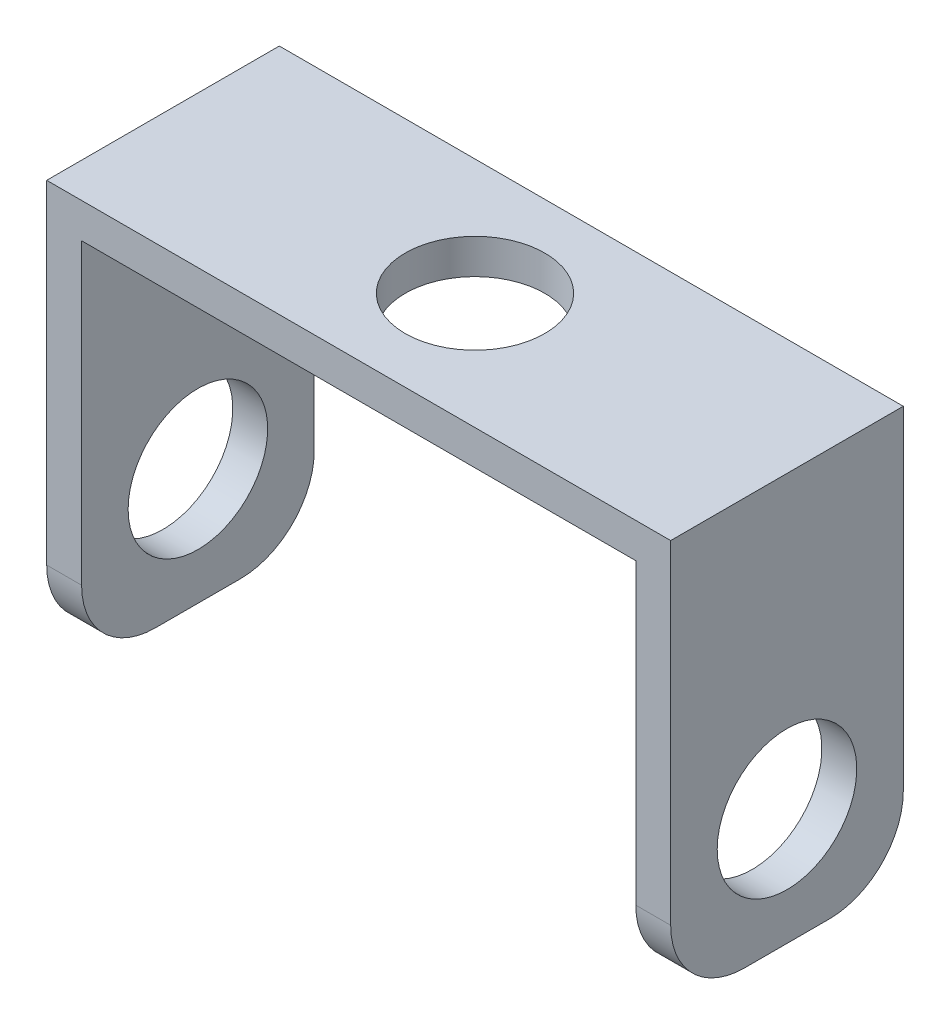
ISO-10303-21;
HEADER;
FILE_DESCRIPTION(('STEP AP214'),'2;1');
FILE_NAME('part.step','',(''),(''),'','','');
FILE_SCHEMA(('AUTOMOTIVE_DESIGN { 1 0 10303 214 1 1 1 1 }'));
ENDSEC;
DATA;
#1=APPLICATION_CONTEXT('core data for automotive mechanical design processes');
#2=APPLICATION_PROTOCOL_DEFINITION('international standard','automotive_design',2000,#1);
#3=PRODUCT_CONTEXT('',#1,'mechanical');
#4=PRODUCT('Part','Part','',(#3));
#5=PRODUCT_RELATED_PRODUCT_CATEGORY('part','',(#4));
#6=PRODUCT_DEFINITION_FORMATION('','',#4);
#7=PRODUCT_DEFINITION_CONTEXT('part definition',#1,'design');
#8=PRODUCT_DEFINITION('design','',#6,#7);
#9=PRODUCT_DEFINITION_SHAPE('','',#8);
#10=(LENGTH_UNIT() NAMED_UNIT(*) SI_UNIT(.MILLI.,.METRE.));
#11=(NAMED_UNIT(*) PLANE_ANGLE_UNIT() SI_UNIT($,.RADIAN.));
#12=(NAMED_UNIT(*) SI_UNIT($,.STERADIAN.) SOLID_ANGLE_UNIT());
#13=UNCERTAINTY_MEASURE_WITH_UNIT(LENGTH_MEASURE(1.E-05),#10,'distance_accuracy_value','');
#14=(GEOMETRIC_REPRESENTATION_CONTEXT(3) GLOBAL_UNCERTAINTY_ASSIGNED_CONTEXT((#13)) GLOBAL_UNIT_ASSIGNED_CONTEXT((#10,
#11,#12)) REPRESENTATION_CONTEXT('',''));
#15=CARTESIAN_POINT('',(0.,0.,0.));
#16=DIRECTION('',(0.,0.,1.));
#17=DIRECTION('',(1.,0.,0.));
#18=AXIS2_PLACEMENT_3D('',#15,#16,#17);
#19=CARTESIAN_POINT('',(0.,3.,0.));
#20=DIRECTION('',(0.,1.,0.));
#21=DIRECTION('',(0.,0.,1.));
#22=AXIS2_PLACEMENT_3D('',#19,#20,#21);
#23=PLANE('',#22);
#24=DIRECTION('',(-1.,0.,0.));
#25=VECTOR('',#24,1.);
#26=CARTESIAN_POINT('',(0.,3.,0.));
#27=LINE('',#26,#25);
#28=CARTESIAN_POINT('',(50.65,3.,0.));
#29=VERTEX_POINT('',#28);
#30=CARTESIAN_POINT('',(-3.,3.,0.));
#31=VERTEX_POINT('',#30);
#32=EDGE_CURVE('E156',#29,#31,#27,.T.);
#33=ORIENTED_EDGE('',*,*,#32,.T.);
#34=DIRECTION('',(0.,0.,-1.));
#35=VECTOR('',#34,1.);
#36=CARTESIAN_POINT('',(-3.,3.,0.));
#37=LINE('',#36,#35);
#38=CARTESIAN_POINT('',(-3.,3.,20.));
#39=VERTEX_POINT('',#38);
#40=EDGE_CURVE('E137',#39,#31,#37,.T.);
#41=ORIENTED_EDGE('',*,*,#40,.F.);
#42=DIRECTION('',(1.,0.,0.));
#43=VECTOR('',#42,1.);
#44=CARTESIAN_POINT('',(0.,3.,20.));
#45=LINE('',#44,#43);
#46=CARTESIAN_POINT('',(50.65,3.,20.));
#47=VERTEX_POINT('',#46);
#48=EDGE_CURVE('E149',#39,#47,#45,.T.);
#49=ORIENTED_EDGE('',*,*,#48,.T.);
#50=DIRECTION('',(0.,0.,1.));
#51=VECTOR('',#50,1.);
#52=CARTESIAN_POINT('',(50.65,3.,20.));
#53=LINE('',#52,#51);
#54=EDGE_CURVE('E192',#29,#47,#53,.T.);
#55=ORIENTED_EDGE('',*,*,#54,.F.);
#56=EDGE_LOOP('',(#33,#41,#49,#55));
#57=FACE_BOUND('',#56,.T.);
#58=CARTESIAN_POINT('',(23.825,3.,10.));
#59=DIRECTION('',(0.,1.,0.));
#60=DIRECTION('',(0.,0.,1.));
#61=AXIS2_PLACEMENT_3D('',#58,#59,#60);
#62=CIRCLE('',#61,6.);
#63=CARTESIAN_POINT('',(23.825,3.,16.));
#64=VERTEX_POINT('',#63);
#65=EDGE_CURVE('E200',#64,#64,#62,.T.);
#66=ORIENTED_EDGE('',*,*,#65,.F.);
#67=EDGE_LOOP('',(#66));
#68=FACE_BOUND('',#67,.T.);
#69=ADVANCED_FACE('F42',(#57,#68),#23,.T.);
#70=CARTESIAN_POINT('',(0.,0.,0.));
#71=DIRECTION('',(0.,1.,0.));
#72=DIRECTION('',(0.,0.,1.));
#73=AXIS2_PLACEMENT_3D('',#70,#71,#72);
#74=PLANE('',#73);
#75=DIRECTION('',(0.,0.,1.));
#76=VECTOR('',#75,1.);
#77=CARTESIAN_POINT('',(0.,0.,0.));
#78=LINE('',#77,#76);
#79=CARTESIAN_POINT('',(0.,0.,0.));
#80=VERTEX_POINT('',#79);
#81=CARTESIAN_POINT('',(0.,0.,20.));
#82=VERTEX_POINT('',#81);
#83=EDGE_CURVE('E204',#80,#82,#78,.T.);
#84=ORIENTED_EDGE('',*,*,#83,.F.);
#85=DIRECTION('',(-1.,0.,0.));
#86=VECTOR('',#85,1.);
#87=CARTESIAN_POINT('',(0.,0.,0.));
#88=LINE('',#87,#86);
#89=CARTESIAN_POINT('',(47.65,0.,0.));
#90=VERTEX_POINT('',#89);
#91=EDGE_CURVE('E157',#90,#80,#88,.T.);
#92=ORIENTED_EDGE('',*,*,#91,.F.);
#93=DIRECTION('',(0.,0.,-1.));
#94=VECTOR('',#93,1.);
#95=CARTESIAN_POINT('',(47.65,0.,0.));
#96=LINE('',#95,#94);
#97=CARTESIAN_POINT('',(47.65,0.,20.));
#98=VERTEX_POINT('',#97);
#99=EDGE_CURVE('E217',#98,#90,#96,.T.);
#100=ORIENTED_EDGE('',*,*,#99,.F.);
#101=DIRECTION('',(1.,0.,0.));
#102=VECTOR('',#101,1.);
#103=CARTESIAN_POINT('',(0.,0.,20.));
#104=LINE('',#103,#102);
#105=EDGE_CURVE('E214',#82,#98,#104,.T.);
#106=ORIENTED_EDGE('',*,*,#105,.F.);
#107=EDGE_LOOP('',(#84,#92,#100,#106));
#108=FACE_BOUND('',#107,.T.);
#109=CARTESIAN_POINT('',(23.825,0.,10.));
#110=DIRECTION('',(0.,1.,0.));
#111=DIRECTION('',(0.,0.,1.));
#112=AXIS2_PLACEMENT_3D('',#109,#110,#111);
#113=CIRCLE('',#112,6.);
#114=CARTESIAN_POINT('',(23.825,0.,16.));
#115=VERTEX_POINT('',#114);
#116=EDGE_CURVE('E194',#115,#115,#113,.T.);
#117=ORIENTED_EDGE('',*,*,#116,.T.);
#118=EDGE_LOOP('',(#117));
#119=FACE_BOUND('',#118,.T.);
#120=ADVANCED_FACE('F287',(#108,#119),#74,.F.);
#121=CARTESIAN_POINT('',(0.,3.,20.));
#122=DIRECTION('',(0.,0.,-1.));
#123=DIRECTION('',(-1.,0.,0.));
#124=AXIS2_PLACEMENT_3D('',#121,#122,#123);
#125=PLANE('',#124);
#126=DIRECTION('',(0.,1.,0.));
#127=VECTOR('',#126,1.);
#128=CARTESIAN_POINT('',(-3.,3.,20.));
#129=LINE('',#128,#127);
#130=CARTESIAN_POINT('',(-3.,-25.65,20.));
#131=VERTEX_POINT('',#130);
#132=EDGE_CURVE('E132',#131,#39,#129,.T.);
#133=ORIENTED_EDGE('',*,*,#132,.F.);
#134=DIRECTION('',(1.,0.,0.));
#135=VECTOR('',#134,1.);
#136=CARTESIAN_POINT('',(0.,-25.65,20.));
#137=LINE('',#136,#135);
#138=CARTESIAN_POINT('',(0.,-25.65,20.));
#139=VERTEX_POINT('',#138);
#140=EDGE_CURVE('E250',#131,#139,#137,.T.);
#141=ORIENTED_EDGE('',*,*,#140,.T.);
#142=DIRECTION('',(0.,1.,0.));
#143=VECTOR('',#142,1.);
#144=CARTESIAN_POINT('',(0.,3.,20.));
#145=LINE('',#144,#143);
#146=EDGE_CURVE('E179',#139,#82,#145,.T.);
#147=ORIENTED_EDGE('',*,*,#146,.T.);
#148=ORIENTED_EDGE('',*,*,#105,.T.);
#149=DIRECTION('',(0.,-1.,0.));
#150=VECTOR('',#149,1.);
#151=CARTESIAN_POINT('',(47.65,3.,20.));
#152=LINE('',#151,#150);
#153=CARTESIAN_POINT('',(47.65,-25.65,20.));
#154=VERTEX_POINT('',#153);
#155=EDGE_CURVE('E162',#98,#154,#152,.T.);
#156=ORIENTED_EDGE('',*,*,#155,.T.);
#157=DIRECTION('',(-1.,0.,0.));
#158=VECTOR('',#157,1.);
#159=CARTESIAN_POINT('',(0.,-25.65,20.));
#160=LINE('',#159,#158);
#161=CARTESIAN_POINT('',(50.65,-25.65,20.));
#162=VERTEX_POINT('',#161);
#163=EDGE_CURVE('E247',#154,#162,#160,.F.);
#164=ORIENTED_EDGE('',*,*,#163,.T.);
#165=DIRECTION('',(0.,-1.,0.));
#166=VECTOR('',#165,1.);
#167=CARTESIAN_POINT('',(50.65,3.,20.));
#168=LINE('',#167,#166);
#169=EDGE_CURVE('E151',#47,#162,#168,.T.);
#170=ORIENTED_EDGE('',*,*,#169,.F.);
#171=ORIENTED_EDGE('',*,*,#48,.F.);
#172=EDGE_LOOP('',(#133,#141,#147,#148,#156,#164,#170,#171));
#173=FACE_BOUND('',#172,.T.);
#174=ADVANCED_FACE('F150',(#173),#125,.F.);
#175=CARTESIAN_POINT('',(0.,3.,0.));
#176=DIRECTION('',(0.,0.,1.));
#177=DIRECTION('',(1.,0.,0.));
#178=AXIS2_PLACEMENT_3D('',#175,#176,#177);
#179=PLANE('',#178);
#180=DIRECTION('',(0.,-1.,0.));
#181=VECTOR('',#180,1.);
#182=CARTESIAN_POINT('',(0.,3.,0.));
#183=LINE('',#182,#181);
#184=CARTESIAN_POINT('',(0.,-25.65,0.));
#185=VERTEX_POINT('',#184);
#186=EDGE_CURVE('E170',#80,#185,#183,.T.);
#187=ORIENTED_EDGE('',*,*,#186,.T.);
#188=DIRECTION('',(1.,0.,0.));
#189=VECTOR('',#188,1.);
#190=CARTESIAN_POINT('',(0.,-25.65,0.));
#191=LINE('',#190,#189);
#192=CARTESIAN_POINT('',(-3.,-25.65,0.));
#193=VERTEX_POINT('',#192);
#194=EDGE_CURVE('E239',#185,#193,#191,.F.);
#195=ORIENTED_EDGE('',*,*,#194,.T.);
#196=DIRECTION('',(0.,-1.,0.));
#197=VECTOR('',#196,1.);
#198=CARTESIAN_POINT('',(-3.,3.,0.));
#199=LINE('',#198,#197);
#200=EDGE_CURVE('E182',#31,#193,#199,.T.);
#201=ORIENTED_EDGE('',*,*,#200,.F.);
#202=ORIENTED_EDGE('',*,*,#32,.F.);
#203=DIRECTION('',(0.,1.,0.));
#204=VECTOR('',#203,1.);
#205=CARTESIAN_POINT('',(50.65,3.,0.));
#206=LINE('',#205,#204);
#207=CARTESIAN_POINT('',(50.65,-25.65,0.));
#208=VERTEX_POINT('',#207);
#209=EDGE_CURVE('E189',#208,#29,#206,.T.);
#210=ORIENTED_EDGE('',*,*,#209,.F.);
#211=DIRECTION('',(-1.,0.,0.));
#212=VECTOR('',#211,1.);
#213=CARTESIAN_POINT('',(0.,-25.65,0.));
#214=LINE('',#213,#212);
#215=CARTESIAN_POINT('',(47.65,-25.65,0.));
#216=VERTEX_POINT('',#215);
#217=EDGE_CURVE('E235',#208,#216,#214,.T.);
#218=ORIENTED_EDGE('',*,*,#217,.T.);
#219=DIRECTION('',(0.,1.,0.));
#220=VECTOR('',#219,1.);
#221=CARTESIAN_POINT('',(47.65,3.,0.));
#222=LINE('',#221,#220);
#223=EDGE_CURVE('E186',#216,#90,#222,.T.);
#224=ORIENTED_EDGE('',*,*,#223,.T.);
#225=ORIENTED_EDGE('',*,*,#91,.T.);
#226=EDGE_LOOP('',(#187,#195,#201,#202,#210,#218,#224,#225));
#227=FACE_BOUND('',#226,.T.);
#228=ADVANCED_FACE('F279',(#227),#179,.F.);
#229=CARTESIAN_POINT('',(23.825,3.,10.));
#230=DIRECTION('',(0.,-1.,0.));
#231=DIRECTION('',(0.,0.,-1.));
#232=AXIS2_PLACEMENT_3D('',#229,#230,#231);
#233=CYLINDRICAL_SURFACE('',#232,6.);
#234=ORIENTED_EDGE('',*,*,#65,.T.);
#235=EDGE_LOOP('',(#234));
#236=FACE_BOUND('',#235,.T.);
#237=ORIENTED_EDGE('',*,*,#116,.F.);
#238=EDGE_LOOP('',(#237));
#239=FACE_BOUND('',#238,.T.);
#240=ADVANCED_FACE('F343',(#236,#239),#233,.F.);
#241=CARTESIAN_POINT('',(47.65,0.,0.));
#242=DIRECTION('',(1.,0.,0.));
#243=DIRECTION('',(0.,0.,-1.));
#244=AXIS2_PLACEMENT_3D('',#241,#242,#243);
#245=PLANE('',#244);
#246=CARTESIAN_POINT('',(47.65,-22.,10.));
#247=DIRECTION('',(1.,0.,0.));
#248=DIRECTION('',(0.,0.,-1.));
#249=AXIS2_PLACEMENT_3D('',#246,#247,#248);
#250=CIRCLE('',#249,6.);
#251=CARTESIAN_POINT('',(47.65,-22.,16.));
#252=VERTEX_POINT('',#251);
#253=EDGE_CURVE('E175',#252,#252,#250,.T.);
#254=ORIENTED_EDGE('',*,*,#253,.T.);
#255=EDGE_LOOP('',(#254));
#256=FACE_BOUND('',#255,.T.);
#257=ORIENTED_EDGE('',*,*,#223,.F.);
#258=CARTESIAN_POINT('',(47.65,-25.65,6.35));
#259=DIRECTION('',(1.,0.,0.));
#260=DIRECTION('',(0.,0.,-1.));
#261=AXIS2_PLACEMENT_3D('',#258,#259,#260);
#262=CIRCLE('',#261,6.35);
#263=CARTESIAN_POINT('',(47.65,-32.,6.35));
#264=VERTEX_POINT('',#263);
#265=EDGE_CURVE('E256',#216,#264,#262,.F.);
#266=ORIENTED_EDGE('',*,*,#265,.T.);
#267=DIRECTION('',(0.,0.,-1.));
#268=VECTOR('',#267,1.);
#269=CARTESIAN_POINT('',(47.65,-32.,20.));
#270=LINE('',#269,#268);
#271=CARTESIAN_POINT('',(47.65,-32.,13.65));
#272=VERTEX_POINT('',#271);
#273=EDGE_CURVE('E166',#272,#264,#270,.T.);
#274=ORIENTED_EDGE('',*,*,#273,.F.);
#275=CARTESIAN_POINT('',(47.65,-25.65,13.65));
#276=DIRECTION('',(1.,0.,0.));
#277=DIRECTION('',(0.,0.,-1.));
#278=AXIS2_PLACEMENT_3D('',#275,#276,#277);
#279=CIRCLE('',#278,6.35);
#280=EDGE_CURVE('E253',#272,#154,#279,.F.);
#281=ORIENTED_EDGE('',*,*,#280,.T.);
#282=ORIENTED_EDGE('',*,*,#155,.F.);
#283=ORIENTED_EDGE('',*,*,#99,.T.);
#284=EDGE_LOOP('',(#257,#266,#274,#281,#282,#283));
#285=FACE_BOUND('',#284,.T.);
#286=ADVANCED_FACE('F271',(#256,#285),#245,.F.);
#287=CARTESIAN_POINT('',(50.65,-32.,20.));
#288=DIRECTION('',(0.,1.,0.));
#289=DIRECTION('',(0.,0.,1.));
#290=AXIS2_PLACEMENT_3D('',#287,#288,#289);
#291=PLANE('',#290);
#292=ORIENTED_EDGE('',*,*,#273,.T.);
#293=DIRECTION('',(-1.,0.,0.));
#294=VECTOR('',#293,1.);
#295=CARTESIAN_POINT('',(50.65,-32.,6.35));
#296=LINE('',#295,#294);
#297=CARTESIAN_POINT('',(50.65,-32.,6.35));
#298=VERTEX_POINT('',#297);
#299=EDGE_CURVE('E58',#264,#298,#296,.F.);
#300=ORIENTED_EDGE('',*,*,#299,.T.);
#301=DIRECTION('',(0.,0.,-1.));
#302=VECTOR('',#301,1.);
#303=CARTESIAN_POINT('',(50.65,-32.,20.));
#304=LINE('',#303,#302);
#305=CARTESIAN_POINT('',(50.65,-32.,13.65));
#306=VERTEX_POINT('',#305);
#307=EDGE_CURVE('E185',#306,#298,#304,.T.);
#308=ORIENTED_EDGE('',*,*,#307,.F.);
#309=DIRECTION('',(-1.,0.,0.));
#310=VECTOR('',#309,1.);
#311=CARTESIAN_POINT('',(50.65,-32.,13.65));
#312=LINE('',#311,#310);
#313=EDGE_CURVE('E259',#306,#272,#312,.T.);
#314=ORIENTED_EDGE('',*,*,#313,.T.);
#315=EDGE_LOOP('',(#292,#300,#308,#314));
#316=FACE_BOUND('',#315,.T.);
#317=ADVANCED_FACE('F267',(#316),#291,.F.);
#318=CARTESIAN_POINT('',(50.65,0.,0.));
#319=DIRECTION('',(1.,0.,0.));
#320=DIRECTION('',(0.,0.,-1.));
#321=AXIS2_PLACEMENT_3D('',#318,#319,#320);
#322=PLANE('',#321);
#323=CARTESIAN_POINT('',(50.65,-22.,10.));
#324=DIRECTION('',(1.,0.,0.));
#325=DIRECTION('',(0.,0.,-1.));
#326=AXIS2_PLACEMENT_3D('',#323,#324,#325);
#327=CIRCLE('',#326,6.);
#328=CARTESIAN_POINT('',(50.65,-22.,16.));
#329=VERTEX_POINT('',#328);
#330=EDGE_CURVE('E312',#329,#329,#327,.F.);
#331=ORIENTED_EDGE('',*,*,#330,.T.);
#332=EDGE_LOOP('',(#331));
#333=FACE_BOUND('',#332,.T.);
#334=ORIENTED_EDGE('',*,*,#307,.T.);
#335=CARTESIAN_POINT('',(50.65,-25.65,6.35));
#336=DIRECTION('',(1.,0.,0.));
#337=DIRECTION('',(0.,0.,-1.));
#338=AXIS2_PLACEMENT_3D('',#335,#336,#337);
#339=CIRCLE('',#338,6.35);
#340=EDGE_CURVE('E11',#298,#208,#339,.T.);
#341=ORIENTED_EDGE('',*,*,#340,.T.);
#342=ORIENTED_EDGE('',*,*,#209,.T.);
#343=ORIENTED_EDGE('',*,*,#54,.T.);
#344=ORIENTED_EDGE('',*,*,#169,.T.);
#345=CARTESIAN_POINT('',(50.65,-25.65,13.65));
#346=DIRECTION('',(1.,0.,0.));
#347=DIRECTION('',(0.,0.,-1.));
#348=AXIS2_PLACEMENT_3D('',#345,#346,#347);
#349=CIRCLE('',#348,6.35);
#350=EDGE_CURVE('E51',#162,#306,#349,.T.);
#351=ORIENTED_EDGE('',*,*,#350,.T.);
#352=EDGE_LOOP('',(#334,#341,#342,#343,#344,#351));
#353=FACE_BOUND('',#352,.T.);
#354=ADVANCED_FACE('F281',(#333,#353),#322,.T.);
#355=CARTESIAN_POINT('',(0.,0.,0.));
#356=DIRECTION('',(-1.,0.,0.));
#357=DIRECTION('',(0.,0.,1.));
#358=AXIS2_PLACEMENT_3D('',#355,#356,#357);
#359=PLANE('',#358);
#360=CARTESIAN_POINT('',(0.,-22.,10.));
#361=DIRECTION('',(-1.,0.,0.));
#362=DIRECTION('',(0.,0.,1.));
#363=AXIS2_PLACEMENT_3D('',#360,#361,#362);
#364=CIRCLE('',#363,6.);
#365=CARTESIAN_POINT('',(0.,-22.,16.));
#366=VERTEX_POINT('',#365);
#367=EDGE_CURVE('E308',#366,#366,#364,.T.);
#368=ORIENTED_EDGE('',*,*,#367,.T.);
#369=EDGE_LOOP('',(#368));
#370=FACE_BOUND('',#369,.T.);
#371=DIRECTION('',(0.,0.,1.));
#372=VECTOR('',#371,1.);
#373=CARTESIAN_POINT('',(0.,-32.,0.));
#374=LINE('',#373,#372);
#375=CARTESIAN_POINT('',(0.,-32.,6.35));
#376=VERTEX_POINT('',#375);
#377=CARTESIAN_POINT('',(0.,-32.,13.65));
#378=VERTEX_POINT('',#377);
#379=EDGE_CURVE('E174',#376,#378,#374,.T.);
#380=ORIENTED_EDGE('',*,*,#379,.F.);
#381=CARTESIAN_POINT('',(0.,-25.65,6.35));
#382=DIRECTION('',(-1.,0.,0.));
#383=DIRECTION('',(0.,0.,1.));
#384=AXIS2_PLACEMENT_3D('',#381,#382,#383);
#385=CIRCLE('',#384,6.35);
#386=EDGE_CURVE('E232',#376,#185,#385,.F.);
#387=ORIENTED_EDGE('',*,*,#386,.T.);
#388=ORIENTED_EDGE('',*,*,#186,.F.);
#389=ORIENTED_EDGE('',*,*,#83,.T.);
#390=ORIENTED_EDGE('',*,*,#146,.F.);
#391=CARTESIAN_POINT('',(0.,-25.65,13.65));
#392=DIRECTION('',(-1.,0.,0.));
#393=DIRECTION('',(0.,0.,1.));
#394=AXIS2_PLACEMENT_3D('',#391,#392,#393);
#395=CIRCLE('',#394,6.35);
#396=EDGE_CURVE('E229',#139,#378,#395,.F.);
#397=ORIENTED_EDGE('',*,*,#396,.T.);
#398=EDGE_LOOP('',(#380,#387,#388,#389,#390,#397));
#399=FACE_BOUND('',#398,.T.);
#400=ADVANCED_FACE('F333',(#370,#399),#359,.F.);
#401=CARTESIAN_POINT('',(-3.,-32.,0.));
#402=DIRECTION('',(0.,1.,0.));
#403=DIRECTION('',(0.,0.,1.));
#404=AXIS2_PLACEMENT_3D('',#401,#402,#403);
#405=PLANE('',#404);
#406=DIRECTION('',(0.,0.,1.));
#407=VECTOR('',#406,1.);
#408=CARTESIAN_POINT('',(-3.,-32.,0.));
#409=LINE('',#408,#407);
#410=CARTESIAN_POINT('',(-3.,-32.,6.35));
#411=VERTEX_POINT('',#410);
#412=CARTESIAN_POINT('',(-3.,-32.,13.65));
#413=VERTEX_POINT('',#412);
#414=EDGE_CURVE('E146',#411,#413,#409,.T.);
#415=ORIENTED_EDGE('',*,*,#414,.F.);
#416=DIRECTION('',(1.,0.,0.));
#417=VECTOR('',#416,1.);
#418=CARTESIAN_POINT('',(-3.,-32.,6.35));
#419=LINE('',#418,#417);
#420=EDGE_CURVE('E225',#411,#376,#419,.T.);
#421=ORIENTED_EDGE('',*,*,#420,.T.);
#422=ORIENTED_EDGE('',*,*,#379,.T.);
#423=DIRECTION('',(1.,0.,0.));
#424=VECTOR('',#423,1.);
#425=CARTESIAN_POINT('',(-3.,-32.,13.65));
#426=LINE('',#425,#424);
#427=EDGE_CURVE('E210',#378,#413,#426,.F.);
#428=ORIENTED_EDGE('',*,*,#427,.T.);
#429=EDGE_LOOP('',(#415,#421,#422,#428));
#430=FACE_BOUND('',#429,.T.);
#431=ADVANCED_FACE('F298',(#430),#405,.F.);
#432=CARTESIAN_POINT('',(-3.,0.,0.));
#433=DIRECTION('',(-1.,0.,0.));
#434=DIRECTION('',(0.,0.,1.));
#435=AXIS2_PLACEMENT_3D('',#432,#433,#434);
#436=PLANE('',#435);
#437=CARTESIAN_POINT('',(-3.,-22.,10.));
#438=DIRECTION('',(-1.,0.,0.));
#439=DIRECTION('',(0.,0.,1.));
#440=AXIS2_PLACEMENT_3D('',#437,#438,#439);
#441=CIRCLE('',#440,6.);
#442=CARTESIAN_POINT('',(-3.,-22.,16.));
#443=VERTEX_POINT('',#442);
#444=EDGE_CURVE('E316',#443,#443,#441,.T.);
#445=ORIENTED_EDGE('',*,*,#444,.F.);
#446=EDGE_LOOP('',(#445));
#447=FACE_BOUND('',#446,.T.);
#448=ORIENTED_EDGE('',*,*,#200,.T.);
#449=CARTESIAN_POINT('',(-3.,-25.65,6.35));
#450=DIRECTION('',(-1.,0.,0.));
#451=DIRECTION('',(0.,0.,1.));
#452=AXIS2_PLACEMENT_3D('',#449,#450,#451);
#453=CIRCLE('',#452,6.35);
#454=EDGE_CURVE('E244',#193,#411,#453,.T.);
#455=ORIENTED_EDGE('',*,*,#454,.T.);
#456=ORIENTED_EDGE('',*,*,#414,.T.);
#457=CARTESIAN_POINT('',(-3.,-25.65,13.65));
#458=DIRECTION('',(-1.,0.,0.));
#459=DIRECTION('',(0.,0.,1.));
#460=AXIS2_PLACEMENT_3D('',#457,#458,#459);
#461=CIRCLE('',#460,6.35);
#462=EDGE_CURVE('E141',#413,#131,#461,.T.);
#463=ORIENTED_EDGE('',*,*,#462,.T.);
#464=ORIENTED_EDGE('',*,*,#132,.T.);
#465=ORIENTED_EDGE('',*,*,#40,.T.);
#466=EDGE_LOOP('',(#448,#455,#456,#463,#464,#465));
#467=FACE_BOUND('',#466,.T.);
#468=ADVANCED_FACE('F135',(#447,#467),#436,.T.);
#469=CARTESIAN_POINT('',(67.6205627484771,-22.,9.99999999999999));
#470=DIRECTION('',(-1.,0.,0.));
#471=DIRECTION('',(0.,0.,1.));
#472=AXIS2_PLACEMENT_3D('',#469,#470,#471);
#473=CYLINDRICAL_SURFACE('',#472,6.);
#474=CARTESIAN_POINT('',(-3.,-22.,16.));
#475=CARTESIAN_POINT('',(-2.96875,-22.,16.));
#476=CARTESIAN_POINT('',(-2.9375,-22.,16.));
#477=CARTESIAN_POINT('',(-2.875,-22.,16.));
#478=CARTESIAN_POINT('',(-2.84375,-22.,16.));
#479=CARTESIAN_POINT('',(-2.78125,-22.,16.));
#480=CARTESIAN_POINT('',(-2.75,-22.,16.));
#481=CARTESIAN_POINT('',(-2.6875,-22.,16.));
#482=CARTESIAN_POINT('',(-2.65625,-22.,16.));
#483=CARTESIAN_POINT('',(-2.59375,-22.,16.));
#484=CARTESIAN_POINT('',(-2.5625,-22.,16.));
#485=CARTESIAN_POINT('',(-2.5,-22.,16.));
#486=CARTESIAN_POINT('',(-2.46875000000001,-22.,16.));
#487=CARTESIAN_POINT('',(-2.40625000000001,-22.,16.));
#488=CARTESIAN_POINT('',(-2.37500000000001,-22.,16.));
#489=CARTESIAN_POINT('',(-2.3125,-22.,16.));
#490=CARTESIAN_POINT('',(-2.28125,-22.,16.));
#491=CARTESIAN_POINT('',(-2.21875,-22.,16.));
#492=CARTESIAN_POINT('',(-2.1875,-22.,16.));
#493=CARTESIAN_POINT('',(-2.125,-22.,16.));
#494=CARTESIAN_POINT('',(-2.09375,-22.,16.));
#495=CARTESIAN_POINT('',(-2.03125,-22.,16.));
#496=CARTESIAN_POINT('',(-2.,-22.,16.));
#497=CARTESIAN_POINT('',(-1.9375,-22.,16.));
#498=CARTESIAN_POINT('',(-1.90625,-22.,16.));
#499=CARTESIAN_POINT('',(-1.84375,-22.,16.));
#500=CARTESIAN_POINT('',(-1.8125,-22.,16.));
#501=CARTESIAN_POINT('',(-1.75,-22.,16.));
#502=CARTESIAN_POINT('',(-1.71875,-22.,16.));
#503=CARTESIAN_POINT('',(-1.65625000000001,-22.,16.));
#504=CARTESIAN_POINT('',(-1.62500000000001,-22.,16.));
#505=CARTESIAN_POINT('',(-1.5625,-22.,16.));
#506=CARTESIAN_POINT('',(-1.53125,-22.,16.));
#507=CARTESIAN_POINT('',(-1.46875,-22.,16.));
#508=CARTESIAN_POINT('',(-1.4375,-22.,16.));
#509=CARTESIAN_POINT('',(-1.375,-22.,16.));
#510=CARTESIAN_POINT('',(-1.34375,-22.,16.));
#511=CARTESIAN_POINT('',(-1.28125,-22.,16.));
#512=CARTESIAN_POINT('',(-1.25,-22.,16.));
#513=CARTESIAN_POINT('',(-1.1875,-22.,16.));
#514=CARTESIAN_POINT('',(-1.15625,-22.,16.));
#515=CARTESIAN_POINT('',(-1.09375,-22.,16.));
#516=CARTESIAN_POINT('',(-1.0625,-22.,16.));
#517=CARTESIAN_POINT('',(-1.,-22.,16.));
#518=CARTESIAN_POINT('',(-0.968750000000004,-22.,16.));
#519=CARTESIAN_POINT('',(-0.906250000000007,-22.,16.));
#520=CARTESIAN_POINT('',(-0.875000000000005,-22.,16.));
#521=CARTESIAN_POINT('',(-0.812500000000003,-22.,16.));
#522=CARTESIAN_POINT('',(-0.781250000000002,-22.,16.));
#523=CARTESIAN_POINT('',(-0.718749999999999,-22.,16.));
#524=CARTESIAN_POINT('',(-0.687499999999998,-22.,16.));
#525=CARTESIAN_POINT('',(-0.624999999999996,-22.,16.));
#526=CARTESIAN_POINT('',(-0.593749999999995,-22.,16.));
#527=CARTESIAN_POINT('',(-0.531249999999997,-22.,16.));
#528=CARTESIAN_POINT('',(-0.5,-22.,16.));
#529=CARTESIAN_POINT('',(-0.437500000000003,-22.,16.));
#530=CARTESIAN_POINT('',(-0.406250000000001,-22.,16.));
#531=CARTESIAN_POINT('',(-0.343749999999999,-22.,16.));
#532=CARTESIAN_POINT('',(-0.312499999999998,-22.,16.));
#533=CARTESIAN_POINT('',(-0.25,-22.,16.));
#534=CARTESIAN_POINT('',(-0.218750000000004,-22.,16.));
#535=CARTESIAN_POINT('',(-0.156250000000006,-22.,16.));
#536=CARTESIAN_POINT('',(-0.125000000000005,-22.,16.));
#537=CARTESIAN_POINT('',(-0.0625000000000024,-22.,16.));
#538=CARTESIAN_POINT('',(-0.0312500000000012,-22.,16.));
#539=CARTESIAN_POINT('',(0.,-22.,16.));
#540=B_SPLINE_CURVE_WITH_KNOTS('',3,(#474,#475,#476,#477,#478,#479,#480,#481,#482,#483,#484,
#485,#486,#487,#488,#489,#490,#491,#492,#493,#494,#495,#496,#497,#498,#499,#500,#501,#502,#503,
#504,#505,#506,#507,#508,#509,#510,#511,#512,#513,#514,#515,#516,#517,#518,#519,#520,#521,#522,
#523,#524,#525,#526,#527,#528,#529,#530,#531,#532,#533,#534,#535,#536,#537,#538,#539),
.UNSPECIFIED.,.F.,.F.,(4,2,2,2,2,2,2,2,2,2,2,2,2,2,2,2,2,2,2,2,2,2,2,2,2,2,2,2,2,2,2,2,4),(0.,
0.0937500000000036,0.187500000000007,0.281249999999997,0.375,0.468750000000004,
0.562499999999994,0.656249999999997,0.750000000000001,0.843750000000004,0.937500000000008,
1.03125,1.125,1.21875,1.31249999999999,1.40625,1.5,1.59375,1.68750000000001,1.78125,1.875,
1.96875000000001,2.06249999999999,2.15625,2.25,2.34375000000001,2.43750000000001,2.53125,2.625,
2.71875000000001,2.8125,2.90625,3.),.UNSPECIFIED.);
#541=EDGE_CURVE('BSEAM321',#443,#366,#540,.T.);
#542=ORIENTED_EDGE('',*,*,#444,.T.);
#543=ORIENTED_EDGE('',*,*,#367,.F.);
#544=ORIENTED_EDGE('',*,*,#541,.T.);
#545=ORIENTED_EDGE('',*,*,#541,.F.);
#546=EDGE_LOOP('',(#542,#544,#543,#545));
#547=FACE_BOUND('',#546,.T.);
#548=ADVANCED_FACE('F321',(#547),#473,.F.);
#549=CARTESIAN_POINT('',(50.65,-22.,16.));
#550=CARTESIAN_POINT('',(50.61875,-22.,16.));
#551=CARTESIAN_POINT('',(50.5875,-22.,16.));
#552=CARTESIAN_POINT('',(50.525,-22.,16.));
#553=CARTESIAN_POINT('',(50.49375,-22.,16.));
#554=CARTESIAN_POINT('',(50.43125,-22.,16.));
#555=CARTESIAN_POINT('',(50.4,-22.,16.));
#556=CARTESIAN_POINT('',(50.3375,-22.,16.));
#557=CARTESIAN_POINT('',(50.30625,-22.,16.));
#558=CARTESIAN_POINT('',(50.24375,-22.,16.));
#559=CARTESIAN_POINT('',(50.2125,-22.,16.));
#560=CARTESIAN_POINT('',(50.15,-22.,16.));
#561=CARTESIAN_POINT('',(50.11875,-22.,16.));
#562=CARTESIAN_POINT('',(50.05625,-22.,16.));
#563=CARTESIAN_POINT('',(50.025,-22.,16.));
#564=CARTESIAN_POINT('',(49.9625,-22.,16.));
#565=CARTESIAN_POINT('',(49.93125,-22.,16.));
#566=CARTESIAN_POINT('',(49.86875,-22.,16.));
#567=CARTESIAN_POINT('',(49.8375,-22.,16.));
#568=CARTESIAN_POINT('',(49.775,-22.,16.));
#569=CARTESIAN_POINT('',(49.74375,-22.,16.));
#570=CARTESIAN_POINT('',(49.68125,-22.,16.));
#571=CARTESIAN_POINT('',(49.65,-22.,16.));
#572=CARTESIAN_POINT('',(49.5875,-22.,16.));
#573=CARTESIAN_POINT('',(49.55625,-22.,16.));
#574=CARTESIAN_POINT('',(49.49375,-22.,16.));
#575=CARTESIAN_POINT('',(49.4625,-22.,16.));
#576=CARTESIAN_POINT('',(49.4,-22.,16.));
#577=CARTESIAN_POINT('',(49.36875,-22.,16.));
#578=CARTESIAN_POINT('',(49.30625,-22.,16.));
#579=CARTESIAN_POINT('',(49.275,-22.,16.));
#580=CARTESIAN_POINT('',(49.2125,-22.,16.));
#581=CARTESIAN_POINT('',(49.18125,-22.,16.));
#582=CARTESIAN_POINT('',(49.11875,-22.,16.));
#583=CARTESIAN_POINT('',(49.0875,-22.,16.));
#584=CARTESIAN_POINT('',(49.025,-22.,16.));
#585=CARTESIAN_POINT('',(48.99375,-22.,16.));
#586=CARTESIAN_POINT('',(48.93125,-22.,16.));
#587=CARTESIAN_POINT('',(48.9,-22.,16.));
#588=CARTESIAN_POINT('',(48.8375,-22.,16.));
#589=CARTESIAN_POINT('',(48.80625,-22.,16.));
#590=CARTESIAN_POINT('',(48.74375,-22.,16.));
#591=CARTESIAN_POINT('',(48.7125,-22.,16.));
#592=CARTESIAN_POINT('',(48.65,-22.,16.));
#593=CARTESIAN_POINT('',(48.61875,-22.,16.));
#594=CARTESIAN_POINT('',(48.55625,-22.,16.));
#595=CARTESIAN_POINT('',(48.525,-22.,16.));
#596=CARTESIAN_POINT('',(48.4625,-22.,16.));
#597=CARTESIAN_POINT('',(48.43125,-22.,16.));
#598=CARTESIAN_POINT('',(48.36875,-22.,16.));
#599=CARTESIAN_POINT('',(48.3375,-22.,16.));
#600=CARTESIAN_POINT('',(48.275,-22.,16.));
#601=CARTESIAN_POINT('',(48.24375,-22.,16.));
#602=CARTESIAN_POINT('',(48.18125,-22.,16.));
#603=CARTESIAN_POINT('',(48.15,-22.,16.));
#604=CARTESIAN_POINT('',(48.0875,-22.,16.));
#605=CARTESIAN_POINT('',(48.05625,-22.,16.));
#606=CARTESIAN_POINT('',(47.99375,-22.,16.));
#607=CARTESIAN_POINT('',(47.9625,-22.,16.));
#608=CARTESIAN_POINT('',(47.9,-22.,16.));
#609=CARTESIAN_POINT('',(47.86875,-22.,16.));
#610=CARTESIAN_POINT('',(47.80625,-22.,16.));
#611=CARTESIAN_POINT('',(47.775,-22.,16.));
#612=CARTESIAN_POINT('',(47.7125,-22.,16.));
#613=CARTESIAN_POINT('',(47.68125,-22.,16.));
#614=CARTESIAN_POINT('',(47.65,-22.,16.));
#615=B_SPLINE_CURVE_WITH_KNOTS('',3,(#549,#550,#551,#552,#553,#554,#555,#556,#557,#558,#559,
#560,#561,#562,#563,#564,#565,#566,#567,#568,#569,#570,#571,#572,#573,#574,#575,#576,#577,#578,
#579,#580,#581,#582,#583,#584,#585,#586,#587,#588,#589,#590,#591,#592,#593,#594,#595,#596,#597,
#598,#599,#600,#601,#602,#603,#604,#605,#606,#607,#608,#609,#610,#611,#612,#613,#614),
.UNSPECIFIED.,.F.,.F.,(4,2,2,2,2,2,2,2,2,2,2,2,2,2,2,2,2,2,2,2,2,2,2,2,2,2,2,2,2,2,2,2,4),(0.,
0.0937500000000036,0.187500000000007,0.281250000000004,0.375,0.468750000000004,
0.562500000000007,0.656250000000004,0.750000000000001,0.843750000000004,0.937500000000008,
1.03125,1.125,1.21875,1.31250000000001,1.40625,1.5,1.59375,1.68750000000001,1.78125000000001,
1.875,1.96875000000001,2.06250000000001,2.15625000000001,2.25,2.34375000000001,2.43750000000001,
2.53125000000001,2.625,2.71875000000001,2.81250000000001,2.90625000000001,3.),.UNSPECIFIED.);
#616=EDGE_CURVE('BSEAM331',#329,#252,#615,.T.);
#617=ORIENTED_EDGE('',*,*,#330,.F.);
#618=ORIENTED_EDGE('',*,*,#253,.F.);
#619=ORIENTED_EDGE('',*,*,#616,.T.);
#620=ORIENTED_EDGE('',*,*,#616,.F.);
#621=EDGE_LOOP('',(#617,#619,#618,#620));
#622=FACE_BOUND('',#621,.T.);
#623=ADVANCED_FACE('F331',(#622),#473,.F.);
#624=CARTESIAN_POINT('',(-3.,-25.65,6.35));
#625=DIRECTION('',(1.,0.,0.));
#626=DIRECTION('',(0.,0.,-1.));
#627=AXIS2_PLACEMENT_3D('',#624,#625,#626);
#628=CYLINDRICAL_SURFACE('',#627,6.35);
#629=ORIENTED_EDGE('',*,*,#454,.F.);
#630=ORIENTED_EDGE('',*,*,#194,.F.);
#631=ORIENTED_EDGE('',*,*,#386,.F.);
#632=ORIENTED_EDGE('',*,*,#420,.F.);
#633=EDGE_LOOP('',(#629,#630,#631,#632));
#634=FACE_BOUND('',#633,.T.);
#635=ADVANCED_FACE('F294',(#634),#628,.T.);
#636=CARTESIAN_POINT('',(0.,-25.65,13.65));
#637=DIRECTION('',(1.,0.,0.));
#638=DIRECTION('',(0.,0.,-1.));
#639=AXIS2_PLACEMENT_3D('',#636,#637,#638);
#640=CYLINDRICAL_SURFACE('',#639,6.35);
#641=ORIENTED_EDGE('',*,*,#462,.F.);
#642=ORIENTED_EDGE('',*,*,#427,.F.);
#643=ORIENTED_EDGE('',*,*,#396,.F.);
#644=ORIENTED_EDGE('',*,*,#140,.F.);
#645=EDGE_LOOP('',(#641,#642,#643,#644));
#646=FACE_BOUND('',#645,.T.);
#647=ADVANCED_FACE('F352',(#646),#640,.T.);
#648=CARTESIAN_POINT('',(0.,-25.65,6.35));
#649=DIRECTION('',(-1.,0.,0.));
#650=DIRECTION('',(0.,0.,1.));
#651=AXIS2_PLACEMENT_3D('',#648,#649,#650);
#652=CYLINDRICAL_SURFACE('',#651,6.35);
#653=ORIENTED_EDGE('',*,*,#340,.F.);
#654=ORIENTED_EDGE('',*,*,#299,.F.);
#655=ORIENTED_EDGE('',*,*,#265,.F.);
#656=ORIENTED_EDGE('',*,*,#217,.F.);
#657=EDGE_LOOP('',(#653,#654,#655,#656));
#658=FACE_BOUND('',#657,.T.);
#659=ADVANCED_FACE('F276',(#658),#652,.T.);
#660=CARTESIAN_POINT('',(50.65,-25.65,13.65));
#661=DIRECTION('',(-1.,0.,0.));
#662=DIRECTION('',(0.,0.,1.));
#663=AXIS2_PLACEMENT_3D('',#660,#661,#662);
#664=CYLINDRICAL_SURFACE('',#663,6.35);
#665=ORIENTED_EDGE('',*,*,#350,.F.);
#666=ORIENTED_EDGE('',*,*,#163,.F.);
#667=ORIENTED_EDGE('',*,*,#280,.F.);
#668=ORIENTED_EDGE('',*,*,#313,.F.);
#669=EDGE_LOOP('',(#665,#666,#667,#668));
#670=FACE_BOUND('',#669,.T.);
#671=ADVANCED_FACE('F44',(#670),#664,.T.);
#672=CLOSED_SHELL('',(#69,#120,#174,#228,#240,#286,#317,#354,#400,#431,#468,#548,#623,#635,#647,
#659,#671));
#673=MANIFOLD_SOLID_BREP('B2',#672);
#674=ADVANCED_BREP_SHAPE_REPRESENTATION('',(#18,#673),#14);
#675=SHAPE_DEFINITION_REPRESENTATION(#9,#674);
ENDSEC;
END-ISO-10303-21;
